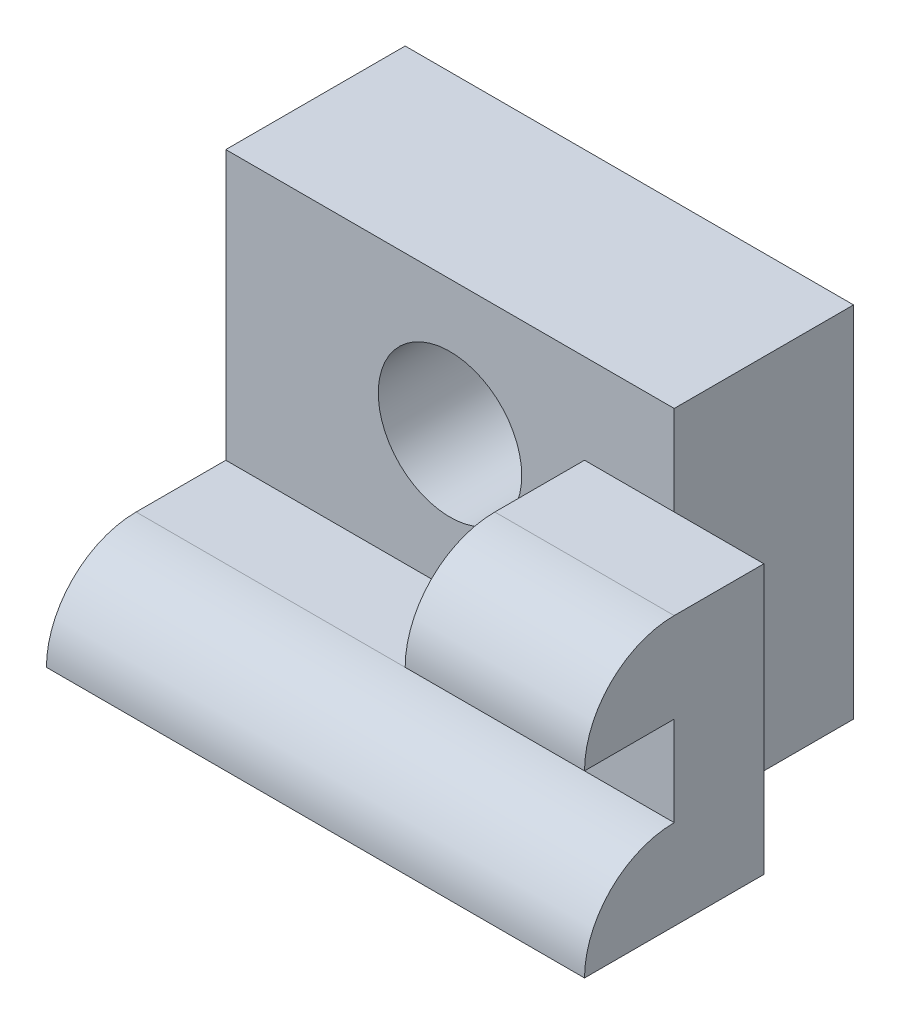
ISO-10303-21;
HEADER;
FILE_DESCRIPTION(('STEP AP214'),'2;1');
FILE_NAME('part.step','',(''),(''),'','','');
FILE_SCHEMA(('AUTOMOTIVE_DESIGN { 1 0 10303 214 1 1 1 1 }'));
ENDSEC;
DATA;
#1=APPLICATION_CONTEXT('core data for automotive mechanical design processes');
#2=APPLICATION_PROTOCOL_DEFINITION('international standard','automotive_design',2000,#1);
#3=PRODUCT_CONTEXT('',#1,'mechanical');
#4=PRODUCT('Part','Part','',(#3));
#5=PRODUCT_RELATED_PRODUCT_CATEGORY('part','',(#4));
#6=PRODUCT_DEFINITION_FORMATION('','',#4);
#7=PRODUCT_DEFINITION_CONTEXT('part definition',#1,'design');
#8=PRODUCT_DEFINITION('design','',#6,#7);
#9=PRODUCT_DEFINITION_SHAPE('','',#8);
#10=(LENGTH_UNIT() NAMED_UNIT(*) SI_UNIT(.MILLI.,.METRE.));
#11=(NAMED_UNIT(*) PLANE_ANGLE_UNIT() SI_UNIT($,.RADIAN.));
#12=(NAMED_UNIT(*) SI_UNIT($,.STERADIAN.) SOLID_ANGLE_UNIT());
#13=UNCERTAINTY_MEASURE_WITH_UNIT(LENGTH_MEASURE(1.E-05),#10,'distance_accuracy_value','');
#14=(GEOMETRIC_REPRESENTATION_CONTEXT(3) GLOBAL_UNCERTAINTY_ASSIGNED_CONTEXT((#13)) GLOBAL_UNIT_ASSIGNED_CONTEXT((#10,
#11,#12)) REPRESENTATION_CONTEXT('',''));
#15=CARTESIAN_POINT('',(0.,0.,0.));
#16=DIRECTION('',(0.,0.,1.));
#17=DIRECTION('',(1.,0.,0.));
#18=AXIS2_PLACEMENT_3D('',#15,#16,#17);
#19=CARTESIAN_POINT('',(-60.,0.,-20.));
#20=DIRECTION('',(0.,0.,1.));
#21=DIRECTION('',(0.,-1.,0.));
#22=AXIS2_PLACEMENT_3D('',#19,#20,#21);
#23=PLANE('',#22);
#24=CARTESIAN_POINT('',(-35.,25.,-20.));
#25=DIRECTION('',(0.,0.,1.));
#26=DIRECTION('',(1.,0.,0.));
#27=AXIS2_PLACEMENT_3D('',#24,#25,#26);
#28=CIRCLE('',#27,8.);
#29=CARTESIAN_POINT('',(-27.,25.,-20.));
#30=VERTEX_POINT('',#29);
#31=EDGE_CURVE('E313',#30,#30,#28,.T.);
#32=ORIENTED_EDGE('',*,*,#31,.F.);
#33=EDGE_LOOP('',(#32));
#34=FACE_BOUND('',#33,.T.);
#35=DIRECTION('',(1.,0.,0.));
#36=VECTOR('',#35,1.);
#37=CARTESIAN_POINT('',(-20.,30.,-20.));
#38=LINE('',#37,#36);
#39=CARTESIAN_POINT('',(-20.,30.,-20.));
#40=VERTEX_POINT('',#39);
#41=CARTESIAN_POINT('',(-10.,30.,-20.));
#42=VERTEX_POINT('',#41);
#43=EDGE_CURVE('E206',#40,#42,#38,.T.);
#44=ORIENTED_EDGE('',*,*,#43,.T.);
#45=DIRECTION('',(0.,-1.,0.));
#46=VECTOR('',#45,1.);
#47=CARTESIAN_POINT('',(-10.,0.,-20.));
#48=LINE('',#47,#46);
#49=CARTESIAN_POINT('',(-10.,40.,-20.));
#50=VERTEX_POINT('',#49);
#51=EDGE_CURVE('E135',#50,#42,#48,.T.);
#52=ORIENTED_EDGE('',*,*,#51,.F.);
#53=DIRECTION('',(1.,0.,0.));
#54=VECTOR('',#53,1.);
#55=CARTESIAN_POINT('',(-60.,40.,-20.));
#56=LINE('',#55,#54);
#57=CARTESIAN_POINT('',(-60.,40.,-20.));
#58=VERTEX_POINT('',#57);
#59=EDGE_CURVE('E171',#58,#50,#56,.T.);
#60=ORIENTED_EDGE('',*,*,#59,.F.);
#61=DIRECTION('',(0.,-1.,0.));
#62=VECTOR('',#61,1.);
#63=CARTESIAN_POINT('',(-60.,0.,-20.));
#64=LINE('',#63,#62);
#65=CARTESIAN_POINT('',(-60.,10.,-20.));
#66=VERTEX_POINT('',#65);
#67=EDGE_CURVE('E162',#58,#66,#64,.T.);
#68=ORIENTED_EDGE('',*,*,#67,.T.);
#69=DIRECTION('',(1.,0.,0.));
#70=VECTOR('',#69,1.);
#71=CARTESIAN_POINT('',(-60.,10.,-20.));
#72=LINE('',#71,#70);
#73=CARTESIAN_POINT('',(-20.,10.,-20.));
#74=VERTEX_POINT('',#73);
#75=EDGE_CURVE('E216',#66,#74,#72,.T.);
#76=ORIENTED_EDGE('',*,*,#75,.T.);
#77=DIRECTION('',(0.,-1.,0.));
#78=VECTOR('',#77,1.);
#79=CARTESIAN_POINT('',(-20.,0.,-20.));
#80=LINE('',#79,#78);
#81=EDGE_CURVE('E186',#40,#74,#80,.T.);
#82=ORIENTED_EDGE('',*,*,#81,.F.);
#83=EDGE_LOOP('',(#44,#52,#60,#68,#76,#82));
#84=FACE_BOUND('',#83,.T.);
#85=ADVANCED_FACE('F39',(#34,#84),#23,.T.);
#86=CARTESIAN_POINT('',(-60.,40.,0.));
#87=DIRECTION('',(0.,1.,0.));
#88=DIRECTION('',(0.,0.,1.));
#89=AXIS2_PLACEMENT_3D('',#86,#87,#88);
#90=PLANE('',#89);
#91=ORIENTED_EDGE('',*,*,#59,.T.);
#92=DIRECTION('',(0.,0.,1.));
#93=VECTOR('',#92,1.);
#94=CARTESIAN_POINT('',(-10.,40.,0.));
#95=LINE('',#94,#93);
#96=CARTESIAN_POINT('',(-10.,40.,-40.));
#97=VERTEX_POINT('',#96);
#98=EDGE_CURVE('E148',#97,#50,#95,.T.);
#99=ORIENTED_EDGE('',*,*,#98,.F.);
#100=DIRECTION('',(1.,0.,0.));
#101=VECTOR('',#100,1.);
#102=CARTESIAN_POINT('',(-60.,40.,-40.));
#103=LINE('',#102,#101);
#104=CARTESIAN_POINT('',(-60.,40.,-40.));
#105=VERTEX_POINT('',#104);
#106=EDGE_CURVE('E175',#105,#97,#103,.T.);
#107=ORIENTED_EDGE('',*,*,#106,.F.);
#108=DIRECTION('',(0.,0.,1.));
#109=VECTOR('',#108,1.);
#110=CARTESIAN_POINT('',(-60.,40.,0.));
#111=LINE('',#110,#109);
#112=EDGE_CURVE('E168',#105,#58,#111,.T.);
#113=ORIENTED_EDGE('',*,*,#112,.T.);
#114=EDGE_LOOP('',(#91,#99,#107,#113));
#115=FACE_BOUND('',#114,.T.);
#116=ADVANCED_FACE('F265',(#115),#90,.T.);
#117=CARTESIAN_POINT('',(-60.,0.,-40.));
#118=DIRECTION('',(0.,0.,-1.));
#119=DIRECTION('',(0.,1.,0.));
#120=AXIS2_PLACEMENT_3D('',#117,#118,#119);
#121=PLANE('',#120);
#122=CARTESIAN_POINT('',(-35.,25.,-40.));
#123=DIRECTION('',(0.,0.,-1.));
#124=DIRECTION('',(0.,1.,0.));
#125=AXIS2_PLACEMENT_3D('',#122,#123,#124);
#126=CIRCLE('',#125,8.);
#127=CARTESIAN_POINT('',(-35.,33.,-40.));
#128=VERTEX_POINT('',#127);
#129=EDGE_CURVE('E43',#128,#128,#126,.T.);
#130=ORIENTED_EDGE('',*,*,#129,.F.);
#131=EDGE_LOOP('',(#130));
#132=FACE_BOUND('',#131,.T.);
#133=ORIENTED_EDGE('',*,*,#106,.T.);
#134=DIRECTION('',(0.,1.,0.));
#135=VECTOR('',#134,1.);
#136=CARTESIAN_POINT('',(-10.,0.,-40.));
#137=LINE('',#136,#135);
#138=CARTESIAN_POINT('',(-10.,0.,-40.));
#139=VERTEX_POINT('',#138);
#140=EDGE_CURVE('E154',#139,#97,#137,.T.);
#141=ORIENTED_EDGE('',*,*,#140,.F.);
#142=DIRECTION('',(1.,0.,0.));
#143=VECTOR('',#142,1.);
#144=CARTESIAN_POINT('',(-60.,0.,-40.));
#145=LINE('',#144,#143);
#146=CARTESIAN_POINT('',(-60.,0.,-40.));
#147=VERTEX_POINT('',#146);
#148=EDGE_CURVE('E153',#147,#139,#145,.T.);
#149=ORIENTED_EDGE('',*,*,#148,.F.);
#150=DIRECTION('',(0.,1.,0.));
#151=VECTOR('',#150,1.);
#152=CARTESIAN_POINT('',(-60.,0.,-40.));
#153=LINE('',#152,#151);
#154=EDGE_CURVE('E165',#147,#105,#153,.T.);
#155=ORIENTED_EDGE('',*,*,#154,.T.);
#156=EDGE_LOOP('',(#133,#141,#149,#155));
#157=FACE_BOUND('',#156,.T.);
#158=ADVANCED_FACE('F262',(#132,#157),#121,.T.);
#159=CARTESIAN_POINT('',(-60.,10.,0.));
#160=DIRECTION('',(0.,-1.,0.));
#161=DIRECTION('',(0.,0.,-1.));
#162=AXIS2_PLACEMENT_3D('',#159,#160,#161);
#163=PLANE('',#162);
#164=DIRECTION('',(0.,0.,-1.));
#165=VECTOR('',#164,1.);
#166=CARTESIAN_POINT('',(-60.,10.,0.));
#167=LINE('',#166,#165);
#168=CARTESIAN_POINT('',(-60.,10.,-10.));
#169=VERTEX_POINT('',#168);
#170=EDGE_CURVE('E210',#169,#66,#167,.T.);
#171=ORIENTED_EDGE('',*,*,#170,.F.);
#172=DIRECTION('',(1.,0.,0.));
#173=VECTOR('',#172,1.);
#174=CARTESIAN_POINT('',(0.,10.,-10.));
#175=LINE('',#174,#173);
#176=CARTESIAN_POINT('',(-20.,10.,-10.));
#177=VERTEX_POINT('',#176);
#178=EDGE_CURVE('E219',#169,#177,#175,.T.);
#179=ORIENTED_EDGE('',*,*,#178,.T.);
#180=DIRECTION('',(0.,0.,-1.));
#181=VECTOR('',#180,1.);
#182=CARTESIAN_POINT('',(-20.,10.,0.));
#183=LINE('',#182,#181);
#184=EDGE_CURVE('E182',#177,#74,#183,.T.);
#185=ORIENTED_EDGE('',*,*,#184,.T.);
#186=ORIENTED_EDGE('',*,*,#75,.F.);
#187=EDGE_LOOP('',(#171,#179,#185,#186));
#188=FACE_BOUND('',#187,.T.);
#189=ADVANCED_FACE('F247',(#188),#163,.F.);
#190=CARTESIAN_POINT('',(-60.,0.,0.));
#191=DIRECTION('',(0.,-1.,0.));
#192=DIRECTION('',(0.,0.,-1.));
#193=AXIS2_PLACEMENT_3D('',#190,#191,#192);
#194=PLANE('',#193);
#195=DIRECTION('',(1.,0.,0.));
#196=VECTOR('',#195,1.);
#197=CARTESIAN_POINT('',(-10.,0.,-20.));
#198=LINE('',#197,#196);
#199=CARTESIAN_POINT('',(-10.,0.,-20.));
#200=VERTEX_POINT('',#199);
#201=CARTESIAN_POINT('',(0.,0.,-20.));
#202=VERTEX_POINT('',#201);
#203=EDGE_CURVE('E141',#200,#202,#198,.T.);
#204=ORIENTED_EDGE('',*,*,#203,.T.);
#205=DIRECTION('',(0.,0.,-1.));
#206=VECTOR('',#205,1.);
#207=CARTESIAN_POINT('',(0.,0.,0.));
#208=LINE('',#207,#206);
#209=CARTESIAN_POINT('',(0.,0.,0.));
#210=VERTEX_POINT('',#209);
#211=EDGE_CURVE('E203',#210,#202,#208,.T.);
#212=ORIENTED_EDGE('',*,*,#211,.F.);
#213=DIRECTION('',(1.,0.,0.));
#214=VECTOR('',#213,1.);
#215=CARTESIAN_POINT('',(-60.,0.,0.));
#216=LINE('',#215,#214);
#217=CARTESIAN_POINT('',(-60.,0.,0.));
#218=VERTEX_POINT('',#217);
#219=EDGE_CURVE('E214',#218,#210,#216,.T.);
#220=ORIENTED_EDGE('',*,*,#219,.F.);
#221=DIRECTION('',(0.,0.,-1.));
#222=VECTOR('',#221,1.);
#223=CARTESIAN_POINT('',(-60.,0.,0.));
#224=LINE('',#223,#222);
#225=EDGE_CURVE('E212',#218,#147,#224,.T.);
#226=ORIENTED_EDGE('',*,*,#225,.T.);
#227=ORIENTED_EDGE('',*,*,#148,.T.);
#228=DIRECTION('',(0.,0.,-1.));
#229=VECTOR('',#228,1.);
#230=CARTESIAN_POINT('',(-10.,0.,0.));
#231=LINE('',#230,#229);
#232=EDGE_CURVE('E132',#200,#139,#231,.T.);
#233=ORIENTED_EDGE('',*,*,#232,.F.);
#234=EDGE_LOOP('',(#204,#212,#220,#226,#227,#233));
#235=FACE_BOUND('',#234,.T.);
#236=ADVANCED_FACE('F151',(#235),#194,.T.);
#237=CARTESIAN_POINT('',(-60.,0.,0.));
#238=DIRECTION('',(1.,0.,0.));
#239=DIRECTION('',(0.,0.,-1.));
#240=AXIS2_PLACEMENT_3D('',#237,#238,#239);
#241=PLANE('',#240);
#242=ORIENTED_EDGE('',*,*,#225,.F.);
#243=CARTESIAN_POINT('',(-60.,0.,-10.));
#244=DIRECTION('',(1.,0.,0.));
#245=DIRECTION('',(0.,0.,-1.));
#246=AXIS2_PLACEMENT_3D('',#243,#244,#245);
#247=CIRCLE('',#246,10.);
#248=EDGE_CURVE('E226',#218,#169,#247,.F.);
#249=ORIENTED_EDGE('',*,*,#248,.T.);
#250=ORIENTED_EDGE('',*,*,#170,.T.);
#251=ORIENTED_EDGE('',*,*,#67,.F.);
#252=ORIENTED_EDGE('',*,*,#112,.F.);
#253=ORIENTED_EDGE('',*,*,#154,.F.);
#254=EDGE_LOOP('',(#242,#249,#250,#251,#252,#253));
#255=FACE_BOUND('',#254,.T.);
#256=ADVANCED_FACE('F259',(#255),#241,.F.);
#257=CARTESIAN_POINT('',(0.,0.,0.));
#258=DIRECTION('',(1.,0.,0.));
#259=DIRECTION('',(0.,0.,-1.));
#260=AXIS2_PLACEMENT_3D('',#257,#258,#259);
#261=PLANE('',#260);
#262=DIRECTION('',(0.,0.,1.));
#263=VECTOR('',#262,1.);
#264=CARTESIAN_POINT('',(0.,30.,0.));
#265=LINE('',#264,#263);
#266=CARTESIAN_POINT('',(0.,30.,-20.));
#267=VERTEX_POINT('',#266);
#268=CARTESIAN_POINT('',(0.,30.,-10.));
#269=VERTEX_POINT('',#268);
#270=EDGE_CURVE('E196',#267,#269,#265,.T.);
#271=ORIENTED_EDGE('',*,*,#270,.T.);
#272=CARTESIAN_POINT('',(0.,20.,-10.));
#273=DIRECTION('',(1.,0.,0.));
#274=DIRECTION('',(0.,0.,-1.));
#275=AXIS2_PLACEMENT_3D('',#272,#273,#274);
#276=CIRCLE('',#275,10.);
#277=CARTESIAN_POINT('',(0.,20.,0.));
#278=VERTEX_POINT('',#277);
#279=EDGE_CURVE('E48',#269,#278,#276,.T.);
#280=ORIENTED_EDGE('',*,*,#279,.T.);
#281=DIRECTION('',(0.,0.,-1.));
#282=VECTOR('',#281,1.);
#283=CARTESIAN_POINT('',(0.,20.,0.));
#284=LINE('',#283,#282);
#285=CARTESIAN_POINT('',(0.,20.,-10.));
#286=VERTEX_POINT('',#285);
#287=EDGE_CURVE('E183',#278,#286,#284,.T.);
#288=ORIENTED_EDGE('',*,*,#287,.T.);
#289=DIRECTION('',(0.,-1.,0.));
#290=VECTOR('',#289,1.);
#291=CARTESIAN_POINT('',(0.,0.,-10.));
#292=LINE('',#291,#290);
#293=CARTESIAN_POINT('',(0.,10.,-10.));
#294=VERTEX_POINT('',#293);
#295=EDGE_CURVE('E174',#286,#294,#292,.T.);
#296=ORIENTED_EDGE('',*,*,#295,.T.);
#297=CARTESIAN_POINT('',(0.,0.,-10.));
#298=DIRECTION('',(1.,0.,0.));
#299=DIRECTION('',(0.,0.,-1.));
#300=AXIS2_PLACEMENT_3D('',#297,#298,#299);
#301=CIRCLE('',#300,10.);
#302=EDGE_CURVE('E224',#294,#210,#301,.T.);
#303=ORIENTED_EDGE('',*,*,#302,.T.);
#304=ORIENTED_EDGE('',*,*,#211,.T.);
#305=DIRECTION('',(0.,-1.,0.));
#306=VECTOR('',#305,1.);
#307=CARTESIAN_POINT('',(0.,0.,-20.));
#308=LINE('',#307,#306);
#309=EDGE_CURVE('E138',#267,#202,#308,.T.);
#310=ORIENTED_EDGE('',*,*,#309,.F.);
#311=EDGE_LOOP('',(#271,#280,#288,#296,#303,#304,#310));
#312=FACE_BOUND('',#311,.T.);
#313=ADVANCED_FACE('F232',(#312),#261,.T.);
#314=CARTESIAN_POINT('',(-20.,0.,-10.));
#315=DIRECTION('',(0.,0.,1.));
#316=DIRECTION('',(0.,-1.,0.));
#317=AXIS2_PLACEMENT_3D('',#314,#315,#316);
#318=PLANE('',#317);
#319=ORIENTED_EDGE('',*,*,#295,.F.);
#320=DIRECTION('',(1.,0.,0.));
#321=VECTOR('',#320,1.);
#322=CARTESIAN_POINT('',(-20.,20.,-10.));
#323=LINE('',#322,#321);
#324=CARTESIAN_POINT('',(-20.,20.,-10.));
#325=VERTEX_POINT('',#324);
#326=EDGE_CURVE('E201',#325,#286,#323,.T.);
#327=ORIENTED_EDGE('',*,*,#326,.F.);
#328=DIRECTION('',(0.,-1.,0.));
#329=VECTOR('',#328,1.);
#330=CARTESIAN_POINT('',(-20.,0.,-10.));
#331=LINE('',#330,#329);
#332=EDGE_CURVE('E179',#325,#177,#331,.T.);
#333=ORIENTED_EDGE('',*,*,#332,.T.);
#334=DIRECTION('',(1.,0.,0.));
#335=VECTOR('',#334,1.);
#336=CARTESIAN_POINT('',(-20.,10.,-10.));
#337=LINE('',#336,#335);
#338=EDGE_CURVE('E193',#177,#294,#337,.T.);
#339=ORIENTED_EDGE('',*,*,#338,.T.);
#340=EDGE_LOOP('',(#319,#327,#333,#339));
#341=FACE_BOUND('',#340,.T.);
#342=ADVANCED_FACE('F251',(#341),#318,.T.);
#343=CARTESIAN_POINT('',(-20.,20.,0.));
#344=DIRECTION('',(0.,-1.,0.));
#345=DIRECTION('',(0.,0.,-1.));
#346=AXIS2_PLACEMENT_3D('',#343,#344,#345);
#347=PLANE('',#346);
#348=ORIENTED_EDGE('',*,*,#287,.F.);
#349=DIRECTION('',(1.,0.,0.));
#350=VECTOR('',#349,1.);
#351=CARTESIAN_POINT('',(-20.,20.,0.));
#352=LINE('',#351,#350);
#353=CARTESIAN_POINT('',(-20.,20.,0.));
#354=VERTEX_POINT('',#353);
#355=EDGE_CURVE('E204',#354,#278,#352,.T.);
#356=ORIENTED_EDGE('',*,*,#355,.F.);
#357=DIRECTION('',(0.,0.,-1.));
#358=VECTOR('',#357,1.);
#359=CARTESIAN_POINT('',(-20.,20.,0.));
#360=LINE('',#359,#358);
#361=EDGE_CURVE('E190',#354,#325,#360,.T.);
#362=ORIENTED_EDGE('',*,*,#361,.T.);
#363=ORIENTED_EDGE('',*,*,#326,.T.);
#364=EDGE_LOOP('',(#348,#356,#362,#363));
#365=FACE_BOUND('',#364,.T.);
#366=ADVANCED_FACE('F235',(#365),#347,.T.);
#367=CARTESIAN_POINT('',(-20.,30.,0.));
#368=DIRECTION('',(0.,1.,0.));
#369=DIRECTION('',(0.,0.,1.));
#370=AXIS2_PLACEMENT_3D('',#367,#368,#369);
#371=PLANE('',#370);
#372=DIRECTION('',(0.,0.,1.));
#373=VECTOR('',#372,1.);
#374=CARTESIAN_POINT('',(-20.,30.,0.));
#375=LINE('',#374,#373);
#376=CARTESIAN_POINT('',(-20.,30.,-10.));
#377=VERTEX_POINT('',#376);
#378=EDGE_CURVE('E188',#40,#377,#375,.T.);
#379=ORIENTED_EDGE('',*,*,#378,.T.);
#380=DIRECTION('',(1.,0.,0.));
#381=VECTOR('',#380,1.);
#382=CARTESIAN_POINT('',(-20.,30.,-10.));
#383=LINE('',#382,#381);
#384=EDGE_CURVE('E228',#377,#269,#383,.T.);
#385=ORIENTED_EDGE('',*,*,#384,.T.);
#386=ORIENTED_EDGE('',*,*,#270,.F.);
#387=DIRECTION('',(1.,0.,0.));
#388=VECTOR('',#387,1.);
#389=CARTESIAN_POINT('',(-20.,30.,-20.));
#390=LINE('',#389,#388);
#391=EDGE_CURVE('E147',#42,#267,#390,.T.);
#392=ORIENTED_EDGE('',*,*,#391,.F.);
#393=ORIENTED_EDGE('',*,*,#43,.F.);
#394=EDGE_LOOP('',(#379,#385,#386,#392,#393));
#395=FACE_BOUND('',#394,.T.);
#396=ADVANCED_FACE('F238',(#395),#371,.T.);
#397=CARTESIAN_POINT('',(-20.,0.,0.));
#398=DIRECTION('',(1.,0.,0.));
#399=DIRECTION('',(0.,0.,-1.));
#400=AXIS2_PLACEMENT_3D('',#397,#398,#399);
#401=PLANE('',#400);
#402=ORIENTED_EDGE('',*,*,#361,.F.);
#403=CARTESIAN_POINT('',(-20.,20.,-10.));
#404=DIRECTION('',(1.,0.,0.));
#405=DIRECTION('',(0.,0.,-1.));
#406=AXIS2_PLACEMENT_3D('',#403,#404,#405);
#407=CIRCLE('',#406,10.);
#408=EDGE_CURVE('E11',#354,#377,#407,.F.);
#409=ORIENTED_EDGE('',*,*,#408,.T.);
#410=ORIENTED_EDGE('',*,*,#378,.F.);
#411=ORIENTED_EDGE('',*,*,#81,.T.);
#412=ORIENTED_EDGE('',*,*,#184,.F.);
#413=ORIENTED_EDGE('',*,*,#332,.F.);
#414=EDGE_LOOP('',(#402,#409,#410,#411,#412,#413));
#415=FACE_BOUND('',#414,.T.);
#416=ADVANCED_FACE('F240',(#415),#401,.F.);
#417=CARTESIAN_POINT('',(-10.,0.,-20.));
#418=DIRECTION('',(0.,0.,1.));
#419=DIRECTION('',(0.,-1.,0.));
#420=AXIS2_PLACEMENT_3D('',#417,#418,#419);
#421=PLANE('',#420);
#422=ORIENTED_EDGE('',*,*,#391,.T.);
#423=ORIENTED_EDGE('',*,*,#309,.T.);
#424=ORIENTED_EDGE('',*,*,#203,.F.);
#425=EDGE_CURVE('E128',#42,#200,#48,.T.);
#426=ORIENTED_EDGE('',*,*,#425,.F.);
#427=EDGE_LOOP('',(#422,#423,#424,#426));
#428=FACE_BOUND('',#427,.T.);
#429=ADVANCED_FACE('F142',(#428),#421,.F.);
#430=CARTESIAN_POINT('',(-10.,0.,0.));
#431=DIRECTION('',(1.,0.,0.));
#432=DIRECTION('',(0.,0.,-1.));
#433=AXIS2_PLACEMENT_3D('',#430,#431,#432);
#434=PLANE('',#433);
#435=ORIENTED_EDGE('',*,*,#51,.T.);
#436=ORIENTED_EDGE('',*,*,#425,.T.);
#437=ORIENTED_EDGE('',*,*,#232,.T.);
#438=ORIENTED_EDGE('',*,*,#140,.T.);
#439=ORIENTED_EDGE('',*,*,#98,.T.);
#440=EDGE_LOOP('',(#435,#436,#437,#438,#439));
#441=FACE_BOUND('',#440,.T.);
#442=ADVANCED_FACE('F130',(#441),#434,.T.);
#443=CARTESIAN_POINT('',(-60.,0.,-10.));
#444=DIRECTION('',(-1.,0.,0.));
#445=DIRECTION('',(0.,0.,1.));
#446=AXIS2_PLACEMENT_3D('',#443,#444,#445);
#447=CYLINDRICAL_SURFACE('',#446,10.);
#448=ORIENTED_EDGE('',*,*,#248,.F.);
#449=ORIENTED_EDGE('',*,*,#219,.T.);
#450=ORIENTED_EDGE('',*,*,#302,.F.);
#451=ORIENTED_EDGE('',*,*,#338,.F.);
#452=ORIENTED_EDGE('',*,*,#178,.F.);
#453=EDGE_LOOP('',(#448,#449,#450,#451,#452));
#454=FACE_BOUND('',#453,.T.);
#455=ADVANCED_FACE('F255',(#454),#447,.T.);
#456=CARTESIAN_POINT('',(-20.,20.,-10.));
#457=DIRECTION('',(1.,0.,0.));
#458=DIRECTION('',(0.,0.,-1.));
#459=AXIS2_PLACEMENT_3D('',#456,#457,#458);
#460=CYLINDRICAL_SURFACE('',#459,10.);
#461=ORIENTED_EDGE('',*,*,#408,.F.);
#462=ORIENTED_EDGE('',*,*,#355,.T.);
#463=ORIENTED_EDGE('',*,*,#279,.F.);
#464=ORIENTED_EDGE('',*,*,#384,.F.);
#465=EDGE_LOOP('',(#461,#462,#463,#464));
#466=FACE_BOUND('',#465,.T.);
#467=ADVANCED_FACE('F41',(#466),#460,.T.);
#468=CARTESIAN_POINT('',(-35.,25.,-56.));
#469=DIRECTION('',(0.,0.,1.));
#470=DIRECTION('',(1.,0.,0.));
#471=AXIS2_PLACEMENT_3D('',#468,#469,#470);
#472=CYLINDRICAL_SURFACE('',#471,8.);
#473=ORIENTED_EDGE('',*,*,#129,.T.);
#474=EDGE_LOOP('',(#473));
#475=FACE_BOUND('',#474,.T.);
#476=ORIENTED_EDGE('',*,*,#31,.T.);
#477=EDGE_LOOP('',(#476));
#478=FACE_BOUND('',#477,.T.);
#479=ADVANCED_FACE('F299',(#475,#478),#472,.F.);
#480=CLOSED_SHELL('',(#85,#116,#158,#189,#236,#256,#313,#342,#366,#396,#416,#429,#442,#455,#467,#479));
#481=MANIFOLD_SOLID_BREP('B2',#480);
#482=ADVANCED_BREP_SHAPE_REPRESENTATION('',(#18,#481),#14);
#483=SHAPE_DEFINITION_REPRESENTATION(#9,#482);
ENDSEC;
END-ISO-10303-21;
